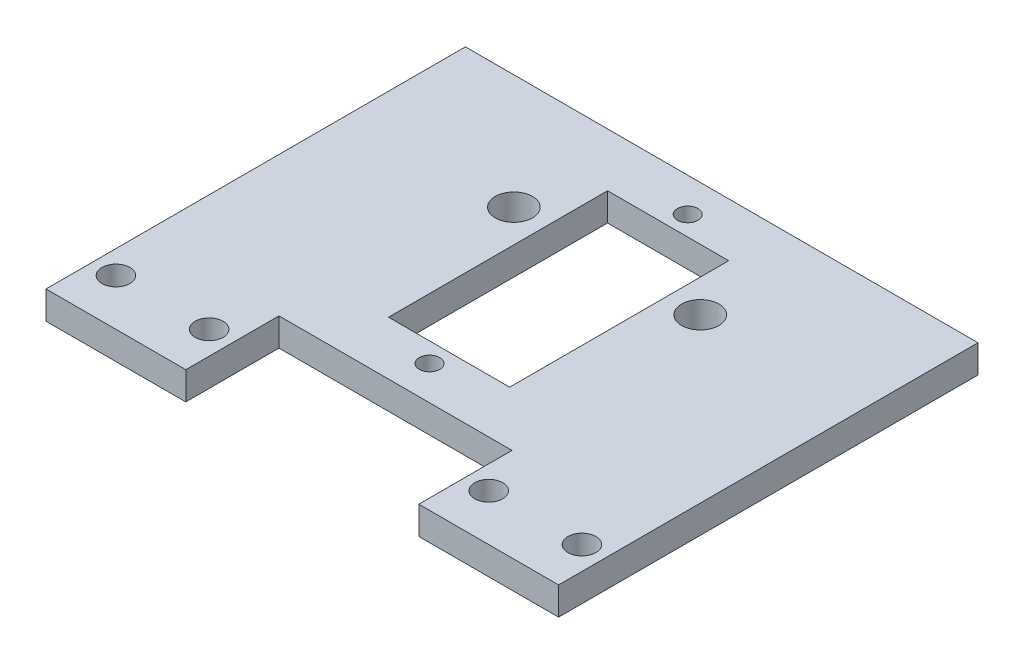
ISO-10303-21;
HEADER;
FILE_DESCRIPTION(('STEP AP214'),'2;1');
FILE_NAME('part.step','',(''),(''),'','','');
FILE_SCHEMA(('AUTOMOTIVE_DESIGN { 1 0 10303 214 1 1 1 1 }'));
ENDSEC;
DATA;
#1=APPLICATION_CONTEXT('core data for automotive mechanical design processes');
#2=APPLICATION_PROTOCOL_DEFINITION('international standard','automotive_design',2000,#1);
#3=PRODUCT_CONTEXT('',#1,'mechanical');
#4=PRODUCT('Part','Part','',(#3));
#5=PRODUCT_RELATED_PRODUCT_CATEGORY('part','',(#4));
#6=PRODUCT_DEFINITION_FORMATION('','',#4);
#7=PRODUCT_DEFINITION_CONTEXT('part definition',#1,'design');
#8=PRODUCT_DEFINITION('design','',#6,#7);
#9=PRODUCT_DEFINITION_SHAPE('','',#8);
#10=(LENGTH_UNIT() NAMED_UNIT(*) SI_UNIT(.MILLI.,.METRE.));
#11=(NAMED_UNIT(*) PLANE_ANGLE_UNIT() SI_UNIT($,.RADIAN.));
#12=(NAMED_UNIT(*) SI_UNIT($,.STERADIAN.) SOLID_ANGLE_UNIT());
#13=UNCERTAINTY_MEASURE_WITH_UNIT(LENGTH_MEASURE(1.E-05),#10,'distance_accuracy_value','');
#14=(GEOMETRIC_REPRESENTATION_CONTEXT(3) GLOBAL_UNCERTAINTY_ASSIGNED_CONTEXT((#13)) GLOBAL_UNIT_ASSIGNED_CONTEXT((#10,
#11,#12)) REPRESENTATION_CONTEXT('',''));
#15=CARTESIAN_POINT('',(0.,0.,0.));
#16=DIRECTION('',(0.,0.,1.));
#17=DIRECTION('',(1.,0.,0.));
#18=AXIS2_PLACEMENT_3D('',#15,#16,#17);
#19=CARTESIAN_POINT('',(0.,3.,0.));
#20=DIRECTION('',(0.,1.,0.));
#21=DIRECTION('',(0.,0.,1.));
#22=AXIS2_PLACEMENT_3D('',#19,#20,#21);
#23=PLANE('',#22);
#24=CARTESIAN_POINT('',(37.4999999999785,3.,-32.6999697831586));
#25=DIRECTION('',(0.,1.,0.));
#26=DIRECTION('',(0.,0.,-1.));
#27=AXIS2_PLACEMENT_3D('',#24,#25,#26);
#28=CIRCLE('',#27,2.);
#29=CARTESIAN_POINT('',(37.4999999999785,3.,-34.6999697831586));
#30=VERTEX_POINT('',#29);
#31=EDGE_CURVE('E341',#30,#30,#28,.T.);
#32=ORIENTED_EDGE('',*,*,#31,.F.);
#33=EDGE_LOOP('',(#32));
#34=FACE_BOUND('',#33,.T.);
#35=CARTESIAN_POINT('',(17.5000000000215,3.,-32.6999697831586));
#36=DIRECTION('',(0.,1.,0.));
#37=DIRECTION('',(0.,0.,1.));
#38=AXIS2_PLACEMENT_3D('',#35,#36,#37);
#39=CIRCLE('',#38,2.);
#40=CARTESIAN_POINT('',(17.5000000000215,3.,-30.6999697831586));
#41=VERTEX_POINT('',#40);
#42=EDGE_CURVE('E347',#41,#41,#39,.T.);
#43=ORIENTED_EDGE('',*,*,#42,.F.);
#44=EDGE_LOOP('',(#43));
#45=FACE_BOUND('',#44,.T.);
#46=CARTESIAN_POINT('',(2.5,3.,-4.99999999999983));
#47=DIRECTION('',(0.,1.,0.));
#48=DIRECTION('',(0.,0.,1.));
#49=AXIS2_PLACEMENT_3D('',#46,#47,#48);
#50=CIRCLE('',#49,1.5);
#51=CARTESIAN_POINT('',(2.5,3.,-3.49999999999983));
#52=VERTEX_POINT('',#51);
#53=EDGE_CURVE('E358',#52,#52,#50,.T.);
#54=ORIENTED_EDGE('',*,*,#53,.F.);
#55=EDGE_LOOP('',(#54));
#56=FACE_BOUND('',#55,.T.);
#57=CARTESIAN_POINT('',(52.5,3.,-5.));
#58=DIRECTION('',(0.,1.,0.));
#59=DIRECTION('',(0.,0.,1.));
#60=AXIS2_PLACEMENT_3D('',#57,#58,#59);
#61=CIRCLE('',#60,1.5);
#62=CARTESIAN_POINT('',(52.5,3.,-3.5));
#63=VERTEX_POINT('',#62);
#64=EDGE_CURVE('E370',#63,#63,#61,.T.);
#65=ORIENTED_EDGE('',*,*,#64,.F.);
#66=EDGE_LOOP('',(#65));
#67=FACE_BOUND('',#66,.T.);
#68=CARTESIAN_POINT('',(27.5,3.,-13.65));
#69=DIRECTION('',(0.,1.,0.));
#70=DIRECTION('',(0.,0.,-1.));
#71=AXIS2_PLACEMENT_3D('',#68,#69,#70);
#72=CIRCLE('',#71,1.09999999999999);
#73=CARTESIAN_POINT('',(27.5,3.,-14.75));
#74=VERTEX_POINT('',#73);
#75=EDGE_CURVE('E163',#74,#74,#72,.T.);
#76=ORIENTED_EDGE('',*,*,#75,.F.);
#77=EDGE_LOOP('',(#76));
#78=FACE_BOUND('',#77,.T.);
#79=DIRECTION('',(0.,0.,1.));
#80=VECTOR('',#79,1.);
#81=CARTESIAN_POINT('',(0.,3.,-45.));
#82=LINE('',#81,#80);
#83=CARTESIAN_POINT('',(0.,3.,-45.));
#84=VERTEX_POINT('',#83);
#85=CARTESIAN_POINT('',(0.,3.,0.));
#86=VERTEX_POINT('',#85);
#87=EDGE_CURVE('E173',#84,#86,#82,.T.);
#88=ORIENTED_EDGE('',*,*,#87,.T.);
#89=DIRECTION('',(1.,0.,0.));
#90=VECTOR('',#89,1.);
#91=CARTESIAN_POINT('',(0.,3.,0.));
#92=LINE('',#91,#90);
#93=CARTESIAN_POINT('',(15.,3.,0.));
#94=VERTEX_POINT('',#93);
#95=EDGE_CURVE('E176',#86,#94,#92,.T.);
#96=ORIENTED_EDGE('',*,*,#95,.T.);
#97=DIRECTION('',(0.,0.,-1.));
#98=VECTOR('',#97,1.);
#99=CARTESIAN_POINT('',(15.,3.,0.));
#100=LINE('',#99,#98);
#101=CARTESIAN_POINT('',(15.,3.,-10.));
#102=VERTEX_POINT('',#101);
#103=EDGE_CURVE('E179',#94,#102,#100,.T.);
#104=ORIENTED_EDGE('',*,*,#103,.T.);
#105=DIRECTION('',(1.,0.,0.));
#106=VECTOR('',#105,1.);
#107=CARTESIAN_POINT('',(15.,3.,-10.));
#108=LINE('',#107,#106);
#109=CARTESIAN_POINT('',(40.,3.,-10.));
#110=VERTEX_POINT('',#109);
#111=EDGE_CURVE('E181',#102,#110,#108,.T.);
#112=ORIENTED_EDGE('',*,*,#111,.T.);
#113=DIRECTION('',(0.,0.,1.));
#114=VECTOR('',#113,1.);
#115=CARTESIAN_POINT('',(40.,3.,-10.));
#116=LINE('',#115,#114);
#117=CARTESIAN_POINT('',(40.,3.,0.));
#118=VERTEX_POINT('',#117);
#119=EDGE_CURVE('E183',#110,#118,#116,.T.);
#120=ORIENTED_EDGE('',*,*,#119,.T.);
#121=DIRECTION('',(1.,0.,0.));
#122=VECTOR('',#121,1.);
#123=CARTESIAN_POINT('',(40.,3.,0.));
#124=LINE('',#123,#122);
#125=CARTESIAN_POINT('',(55.,3.,0.));
#126=VERTEX_POINT('',#125);
#127=EDGE_CURVE('E185',#118,#126,#124,.T.);
#128=ORIENTED_EDGE('',*,*,#127,.T.);
#129=DIRECTION('',(0.,0.,-1.));
#130=VECTOR('',#129,1.);
#131=CARTESIAN_POINT('',(55.,3.,0.));
#132=LINE('',#131,#130);
#133=CARTESIAN_POINT('',(55.,3.,-45.));
#134=VERTEX_POINT('',#133);
#135=EDGE_CURVE('E187',#126,#134,#132,.T.);
#136=ORIENTED_EDGE('',*,*,#135,.T.);
#137=DIRECTION('',(-1.,0.,0.));
#138=VECTOR('',#137,1.);
#139=CARTESIAN_POINT('',(55.,3.,-45.));
#140=LINE('',#139,#138);
#141=EDGE_CURVE('E189',#134,#84,#140,.T.);
#142=ORIENTED_EDGE('',*,*,#141,.T.);
#143=EDGE_LOOP('',(#88,#96,#104,#112,#120,#128,#136,#142));
#144=FACE_BOUND('',#143,.T.);
#145=DIRECTION('',(1.,0.,0.));
#146=VECTOR('',#145,1.);
#147=CARTESIAN_POINT('',(21.0000000000001,3.,-15.7499999999999));
#148=LINE('',#147,#146);
#149=CARTESIAN_POINT('',(21.0000000000001,3.,-15.7499999999999));
#150=VERTEX_POINT('',#149);
#151=CARTESIAN_POINT('',(34.0000000000001,3.,-15.75));
#152=VERTEX_POINT('',#151);
#153=EDGE_CURVE('E142',#150,#152,#148,.T.);
#154=ORIENTED_EDGE('',*,*,#153,.F.);
#155=DIRECTION('',(0.,0.,1.));
#156=VECTOR('',#155,1.);
#157=CARTESIAN_POINT('',(20.9999999999999,3.,-39.2499999999999));
#158=LINE('',#157,#156);
#159=CARTESIAN_POINT('',(20.9999999999999,3.,-39.2499999999999));
#160=VERTEX_POINT('',#159);
#161=EDGE_CURVE('E134',#160,#150,#158,.T.);
#162=ORIENTED_EDGE('',*,*,#161,.F.);
#163=DIRECTION('',(-1.,0.,0.));
#164=VECTOR('',#163,1.);
#165=CARTESIAN_POINT('',(20.9999999999999,3.,-39.2499999999999));
#166=LINE('',#165,#164);
#167=CARTESIAN_POINT('',(33.9999999999999,3.,-39.25));
#168=VERTEX_POINT('',#167);
#169=EDGE_CURVE('E157',#168,#160,#166,.T.);
#170=ORIENTED_EDGE('',*,*,#169,.F.);
#171=DIRECTION('',(0.,0.,-1.));
#172=VECTOR('',#171,1.);
#173=CARTESIAN_POINT('',(33.9999999999999,3.,-39.25));
#174=LINE('',#173,#172);
#175=EDGE_CURVE('E155',#152,#168,#174,.T.);
#176=ORIENTED_EDGE('',*,*,#175,.F.);
#177=EDGE_LOOP('',(#154,#162,#170,#176));
#178=FACE_BOUND('',#177,.T.);
#179=CARTESIAN_POINT('',(42.5,3.,-5.));
#180=DIRECTION('',(0.,1.,0.));
#181=DIRECTION('',(0.,0.,1.));
#182=AXIS2_PLACEMENT_3D('',#179,#180,#181);
#183=CIRCLE('',#182,1.5);
#184=CARTESIAN_POINT('',(42.5,3.,-3.5));
#185=VERTEX_POINT('',#184);
#186=EDGE_CURVE('E376',#185,#185,#183,.T.);
#187=ORIENTED_EDGE('',*,*,#186,.F.);
#188=EDGE_LOOP('',(#187));
#189=FACE_BOUND('',#188,.T.);
#190=CARTESIAN_POINT('',(12.5,3.,-4.9999999999999));
#191=DIRECTION('',(0.,1.,0.));
#192=DIRECTION('',(0.,0.,1.));
#193=AXIS2_PLACEMENT_3D('',#190,#191,#192);
#194=CIRCLE('',#193,1.5);
#195=CARTESIAN_POINT('',(12.5,3.,-3.49999999999989));
#196=VERTEX_POINT('',#195);
#197=EDGE_CURVE('E364',#196,#196,#194,.T.);
#198=ORIENTED_EDGE('',*,*,#197,.F.);
#199=EDGE_LOOP('',(#198));
#200=FACE_BOUND('',#199,.T.);
#201=CARTESIAN_POINT('',(27.5,3.,-41.35));
#202=DIRECTION('',(0.,1.,0.));
#203=DIRECTION('',(0.,0.,1.));
#204=AXIS2_PLACEMENT_3D('',#201,#202,#203);
#205=CIRCLE('',#204,1.09999999999999);
#206=CARTESIAN_POINT('',(27.5,3.,-40.25));
#207=VERTEX_POINT('',#206);
#208=EDGE_CURVE('E352',#207,#207,#205,.T.);
#209=ORIENTED_EDGE('',*,*,#208,.F.);
#210=EDGE_LOOP('',(#209));
#211=FACE_BOUND('',#210,.T.);
#212=ADVANCED_FACE('F45',(#34,#45,#56,#67,#78,#144,#178,#189,#200,#211),#23,.T.);
#213=CARTESIAN_POINT('',(0.,0.,0.));
#214=DIRECTION('',(0.,1.,0.));
#215=DIRECTION('',(0.,0.,1.));
#216=AXIS2_PLACEMENT_3D('',#213,#214,#215);
#217=PLANE('',#216);
#218=CARTESIAN_POINT('',(37.4999999999785,0.,-32.6999697831586));
#219=DIRECTION('',(0.,1.,0.));
#220=DIRECTION('',(0.,0.,-1.));
#221=AXIS2_PLACEMENT_3D('',#218,#219,#220);
#222=CIRCLE('',#221,2.);
#223=CARTESIAN_POINT('',(37.4999999999785,0.,-34.6999697831586));
#224=VERTEX_POINT('',#223);
#225=EDGE_CURVE('E339',#224,#224,#222,.T.);
#226=ORIENTED_EDGE('',*,*,#225,.T.);
#227=EDGE_LOOP('',(#226));
#228=FACE_BOUND('',#227,.T.);
#229=CARTESIAN_POINT('',(17.5000000000215,0.,-32.6999697831586));
#230=DIRECTION('',(0.,1.,0.));
#231=DIRECTION('',(0.,0.,1.));
#232=AXIS2_PLACEMENT_3D('',#229,#230,#231);
#233=CIRCLE('',#232,2.);
#234=CARTESIAN_POINT('',(17.5000000000215,0.,-30.6999697831586));
#235=VERTEX_POINT('',#234);
#236=EDGE_CURVE('E342',#235,#235,#233,.T.);
#237=ORIENTED_EDGE('',*,*,#236,.T.);
#238=EDGE_LOOP('',(#237));
#239=FACE_BOUND('',#238,.T.);
#240=DIRECTION('',(0.,0.,1.));
#241=VECTOR('',#240,1.);
#242=CARTESIAN_POINT('',(0.,0.,-45.));
#243=LINE('',#242,#241);
#244=CARTESIAN_POINT('',(0.,0.,-45.));
#245=VERTEX_POINT('',#244);
#246=CARTESIAN_POINT('',(0.,0.,0.));
#247=VERTEX_POINT('',#246);
#248=EDGE_CURVE('E150',#245,#247,#243,.T.);
#249=ORIENTED_EDGE('',*,*,#248,.F.);
#250=DIRECTION('',(-1.,0.,0.));
#251=VECTOR('',#250,1.);
#252=CARTESIAN_POINT('',(55.,0.,-45.));
#253=LINE('',#252,#251);
#254=CARTESIAN_POINT('',(55.,0.,-45.));
#255=VERTEX_POINT('',#254);
#256=EDGE_CURVE('E177',#255,#245,#253,.T.);
#257=ORIENTED_EDGE('',*,*,#256,.F.);
#258=DIRECTION('',(0.,0.,-1.));
#259=VECTOR('',#258,1.);
#260=CARTESIAN_POINT('',(55.,0.,0.));
#261=LINE('',#260,#259);
#262=CARTESIAN_POINT('',(55.,0.,0.));
#263=VERTEX_POINT('',#262);
#264=EDGE_CURVE('E204',#263,#255,#261,.T.);
#265=ORIENTED_EDGE('',*,*,#264,.F.);
#266=DIRECTION('',(1.,0.,0.));
#267=VECTOR('',#266,1.);
#268=CARTESIAN_POINT('',(40.,0.,0.));
#269=LINE('',#268,#267);
#270=CARTESIAN_POINT('',(40.,0.,0.));
#271=VERTEX_POINT('',#270);
#272=EDGE_CURVE('E202',#271,#263,#269,.T.);
#273=ORIENTED_EDGE('',*,*,#272,.F.);
#274=DIRECTION('',(0.,0.,1.));
#275=VECTOR('',#274,1.);
#276=CARTESIAN_POINT('',(40.,0.,-10.));
#277=LINE('',#276,#275);
#278=CARTESIAN_POINT('',(40.,0.,-10.));
#279=VERTEX_POINT('',#278);
#280=EDGE_CURVE('E200',#279,#271,#277,.T.);
#281=ORIENTED_EDGE('',*,*,#280,.F.);
#282=DIRECTION('',(1.,0.,0.));
#283=VECTOR('',#282,1.);
#284=CARTESIAN_POINT('',(15.,0.,-10.));
#285=LINE('',#284,#283);
#286=CARTESIAN_POINT('',(15.,0.,-10.));
#287=VERTEX_POINT('',#286);
#288=EDGE_CURVE('E198',#287,#279,#285,.T.);
#289=ORIENTED_EDGE('',*,*,#288,.F.);
#290=DIRECTION('',(0.,0.,-1.));
#291=VECTOR('',#290,1.);
#292=CARTESIAN_POINT('',(15.,0.,0.));
#293=LINE('',#292,#291);
#294=CARTESIAN_POINT('',(15.,0.,0.));
#295=VERTEX_POINT('',#294);
#296=EDGE_CURVE('E196',#295,#287,#293,.T.);
#297=ORIENTED_EDGE('',*,*,#296,.F.);
#298=DIRECTION('',(1.,0.,0.));
#299=VECTOR('',#298,1.);
#300=CARTESIAN_POINT('',(0.,0.,0.));
#301=LINE('',#300,#299);
#302=EDGE_CURVE('E194',#247,#295,#301,.T.);
#303=ORIENTED_EDGE('',*,*,#302,.F.);
#304=EDGE_LOOP('',(#249,#257,#265,#273,#281,#289,#297,#303));
#305=FACE_BOUND('',#304,.T.);
#306=DIRECTION('',(0.,0.,1.));
#307=VECTOR('',#306,1.);
#308=CARTESIAN_POINT('',(20.9999999999999,0.,-39.2499999999999));
#309=LINE('',#308,#307);
#310=CARTESIAN_POINT('',(20.9999999999999,0.,-39.2499999999999));
#311=VERTEX_POINT('',#310);
#312=CARTESIAN_POINT('',(21.0000000000001,0.,-15.7499999999999));
#313=VERTEX_POINT('',#312);
#314=EDGE_CURVE('E68',#311,#313,#309,.T.);
#315=ORIENTED_EDGE('',*,*,#314,.T.);
#316=DIRECTION('',(1.,0.,0.));
#317=VECTOR('',#316,1.);
#318=CARTESIAN_POINT('',(21.0000000000001,0.,-15.7499999999999));
#319=LINE('',#318,#317);
#320=CARTESIAN_POINT('',(34.0000000000001,0.,-15.75));
#321=VERTEX_POINT('',#320);
#322=EDGE_CURVE('E149',#313,#321,#319,.T.);
#323=ORIENTED_EDGE('',*,*,#322,.T.);
#324=DIRECTION('',(0.,0.,-1.));
#325=VECTOR('',#324,1.);
#326=CARTESIAN_POINT('',(33.9999999999999,0.,-39.25));
#327=LINE('',#326,#325);
#328=CARTESIAN_POINT('',(33.9999999999999,0.,-39.25));
#329=VERTEX_POINT('',#328);
#330=EDGE_CURVE('E165',#321,#329,#327,.T.);
#331=ORIENTED_EDGE('',*,*,#330,.T.);
#332=DIRECTION('',(-1.,0.,0.));
#333=VECTOR('',#332,1.);
#334=CARTESIAN_POINT('',(20.9999999999999,0.,-39.2499999999999));
#335=LINE('',#334,#333);
#336=EDGE_CURVE('E143',#329,#311,#335,.T.);
#337=ORIENTED_EDGE('',*,*,#336,.T.);
#338=EDGE_LOOP('',(#315,#323,#331,#337));
#339=FACE_BOUND('',#338,.T.);
#340=CARTESIAN_POINT('',(27.5,0.,-13.65));
#341=DIRECTION('',(0.,1.,0.));
#342=DIRECTION('',(0.,0.,-1.));
#343=AXIS2_PLACEMENT_3D('',#340,#341,#342);
#344=CIRCLE('',#343,1.09999999999999);
#345=CARTESIAN_POINT('',(27.5,0.,-14.75));
#346=VERTEX_POINT('',#345);
#347=EDGE_CURVE('E379',#346,#346,#344,.T.);
#348=ORIENTED_EDGE('',*,*,#347,.T.);
#349=EDGE_LOOP('',(#348));
#350=FACE_BOUND('',#349,.T.);
#351=CARTESIAN_POINT('',(42.5,0.,-5.));
#352=DIRECTION('',(0.,1.,0.));
#353=DIRECTION('',(0.,0.,1.));
#354=AXIS2_PLACEMENT_3D('',#351,#352,#353);
#355=CIRCLE('',#354,1.5);
#356=CARTESIAN_POINT('',(42.5,0.,-3.5));
#357=VERTEX_POINT('',#356);
#358=EDGE_CURVE('E373',#357,#357,#355,.T.);
#359=ORIENTED_EDGE('',*,*,#358,.T.);
#360=EDGE_LOOP('',(#359));
#361=FACE_BOUND('',#360,.T.);
#362=CARTESIAN_POINT('',(52.5,0.,-5.));
#363=DIRECTION('',(0.,1.,0.));
#364=DIRECTION('',(0.,0.,1.));
#365=AXIS2_PLACEMENT_3D('',#362,#363,#364);
#366=CIRCLE('',#365,1.5);
#367=CARTESIAN_POINT('',(52.5,0.,-3.5));
#368=VERTEX_POINT('',#367);
#369=EDGE_CURVE('E367',#368,#368,#366,.T.);
#370=ORIENTED_EDGE('',*,*,#369,.T.);
#371=EDGE_LOOP('',(#370));
#372=FACE_BOUND('',#371,.T.);
#373=CARTESIAN_POINT('',(12.5,0.,-4.9999999999999));
#374=DIRECTION('',(0.,1.,0.));
#375=DIRECTION('',(0.,0.,1.));
#376=AXIS2_PLACEMENT_3D('',#373,#374,#375);
#377=CIRCLE('',#376,1.5);
#378=CARTESIAN_POINT('',(12.5,0.,-3.49999999999989));
#379=VERTEX_POINT('',#378);
#380=EDGE_CURVE('E361',#379,#379,#377,.T.);
#381=ORIENTED_EDGE('',*,*,#380,.T.);
#382=EDGE_LOOP('',(#381));
#383=FACE_BOUND('',#382,.T.);
#384=CARTESIAN_POINT('',(2.5,0.,-4.99999999999983));
#385=DIRECTION('',(0.,1.,0.));
#386=DIRECTION('',(0.,0.,1.));
#387=AXIS2_PLACEMENT_3D('',#384,#385,#386);
#388=CIRCLE('',#387,1.5);
#389=CARTESIAN_POINT('',(2.5,0.,-3.49999999999983));
#390=VERTEX_POINT('',#389);
#391=EDGE_CURVE('E355',#390,#390,#388,.T.);
#392=ORIENTED_EDGE('',*,*,#391,.T.);
#393=EDGE_LOOP('',(#392));
#394=FACE_BOUND('',#393,.T.);
#395=CARTESIAN_POINT('',(27.5,0.,-41.35));
#396=DIRECTION('',(0.,1.,0.));
#397=DIRECTION('',(0.,0.,1.));
#398=AXIS2_PLACEMENT_3D('',#395,#396,#397);
#399=CIRCLE('',#398,1.09999999999999);
#400=CARTESIAN_POINT('',(27.5,0.,-40.25));
#401=VERTEX_POINT('',#400);
#402=EDGE_CURVE('E344',#401,#401,#399,.T.);
#403=ORIENTED_EDGE('',*,*,#402,.T.);
#404=EDGE_LOOP('',(#403));
#405=FACE_BOUND('',#404,.T.);
#406=ADVANCED_FACE('F234',(#228,#239,#305,#339,#350,#361,#372,#383,#394,#405),#217,.F.);
#407=CARTESIAN_POINT('',(0.,3.,-45.));
#408=DIRECTION('',(1.,0.,0.));
#409=DIRECTION('',(0.,0.,-1.));
#410=AXIS2_PLACEMENT_3D('',#407,#408,#409);
#411=PLANE('',#410);
#412=ORIENTED_EDGE('',*,*,#248,.T.);
#413=DIRECTION('',(0.,-1.,0.));
#414=VECTOR('',#413,1.);
#415=CARTESIAN_POINT('',(0.,3.,0.));
#416=LINE('',#415,#414);
#417=EDGE_CURVE('E11',#86,#247,#416,.T.);
#418=ORIENTED_EDGE('',*,*,#417,.F.);
#419=ORIENTED_EDGE('',*,*,#87,.F.);
#420=DIRECTION('',(0.,-1.,0.));
#421=VECTOR('',#420,1.);
#422=CARTESIAN_POINT('',(0.,3.,-45.));
#423=LINE('',#422,#421);
#424=EDGE_CURVE('E191',#84,#245,#423,.T.);
#425=ORIENTED_EDGE('',*,*,#424,.T.);
#426=EDGE_LOOP('',(#412,#418,#419,#425));
#427=FACE_BOUND('',#426,.T.);
#428=ADVANCED_FACE('F47',(#427),#411,.F.);
#429=CARTESIAN_POINT('',(0.,3.,0.));
#430=DIRECTION('',(0.,0.,-1.));
#431=DIRECTION('',(-1.,0.,0.));
#432=AXIS2_PLACEMENT_3D('',#429,#430,#431);
#433=PLANE('',#432);
#434=ORIENTED_EDGE('',*,*,#302,.T.);
#435=DIRECTION('',(0.,-1.,0.));
#436=VECTOR('',#435,1.);
#437=CARTESIAN_POINT('',(15.,3.,0.));
#438=LINE('',#437,#436);
#439=EDGE_CURVE('E53',#94,#295,#438,.T.);
#440=ORIENTED_EDGE('',*,*,#439,.F.);
#441=ORIENTED_EDGE('',*,*,#95,.F.);
#442=ORIENTED_EDGE('',*,*,#417,.T.);
#443=EDGE_LOOP('',(#434,#440,#441,#442));
#444=FACE_BOUND('',#443,.T.);
#445=ADVANCED_FACE('F251',(#444),#433,.F.);
#446=CARTESIAN_POINT('',(15.,3.,0.));
#447=DIRECTION('',(-1.,0.,0.));
#448=DIRECTION('',(0.,0.,1.));
#449=AXIS2_PLACEMENT_3D('',#446,#447,#448);
#450=PLANE('',#449);
#451=ORIENTED_EDGE('',*,*,#296,.T.);
#452=DIRECTION('',(0.,-1.,0.));
#453=VECTOR('',#452,1.);
#454=CARTESIAN_POINT('',(15.,3.,-10.));
#455=LINE('',#454,#453);
#456=EDGE_CURVE('E221',#102,#287,#455,.T.);
#457=ORIENTED_EDGE('',*,*,#456,.F.);
#458=ORIENTED_EDGE('',*,*,#103,.F.);
#459=ORIENTED_EDGE('',*,*,#439,.T.);
#460=EDGE_LOOP('',(#451,#457,#458,#459));
#461=FACE_BOUND('',#460,.T.);
#462=ADVANCED_FACE('F228',(#461),#450,.F.);
#463=CARTESIAN_POINT('',(15.,3.,-10.));
#464=DIRECTION('',(0.,0.,-1.));
#465=DIRECTION('',(-1.,0.,0.));
#466=AXIS2_PLACEMENT_3D('',#463,#464,#465);
#467=PLANE('',#466);
#468=ORIENTED_EDGE('',*,*,#288,.T.);
#469=DIRECTION('',(0.,-1.,0.));
#470=VECTOR('',#469,1.);
#471=CARTESIAN_POINT('',(40.,3.,-10.));
#472=LINE('',#471,#470);
#473=EDGE_CURVE('E218',#110,#279,#472,.T.);
#474=ORIENTED_EDGE('',*,*,#473,.F.);
#475=ORIENTED_EDGE('',*,*,#111,.F.);
#476=ORIENTED_EDGE('',*,*,#456,.T.);
#477=EDGE_LOOP('',(#468,#474,#475,#476));
#478=FACE_BOUND('',#477,.T.);
#479=ADVANCED_FACE('F240',(#478),#467,.F.);
#480=CARTESIAN_POINT('',(40.,3.,-10.));
#481=DIRECTION('',(1.,0.,0.));
#482=DIRECTION('',(0.,0.,-1.));
#483=AXIS2_PLACEMENT_3D('',#480,#481,#482);
#484=PLANE('',#483);
#485=ORIENTED_EDGE('',*,*,#280,.T.);
#486=DIRECTION('',(0.,-1.,0.));
#487=VECTOR('',#486,1.);
#488=CARTESIAN_POINT('',(40.,3.,0.));
#489=LINE('',#488,#487);
#490=EDGE_CURVE('E215',#118,#271,#489,.T.);
#491=ORIENTED_EDGE('',*,*,#490,.F.);
#492=ORIENTED_EDGE('',*,*,#119,.F.);
#493=ORIENTED_EDGE('',*,*,#473,.T.);
#494=EDGE_LOOP('',(#485,#491,#492,#493));
#495=FACE_BOUND('',#494,.T.);
#496=ADVANCED_FACE('F244',(#495),#484,.F.);
#497=CARTESIAN_POINT('',(40.,3.,0.));
#498=DIRECTION('',(0.,0.,-1.));
#499=DIRECTION('',(-1.,0.,0.));
#500=AXIS2_PLACEMENT_3D('',#497,#498,#499);
#501=PLANE('',#500);
#502=ORIENTED_EDGE('',*,*,#272,.T.);
#503=DIRECTION('',(0.,-1.,0.));
#504=VECTOR('',#503,1.);
#505=CARTESIAN_POINT('',(55.,3.,0.));
#506=LINE('',#505,#504);
#507=EDGE_CURVE('E212',#126,#263,#506,.T.);
#508=ORIENTED_EDGE('',*,*,#507,.F.);
#509=ORIENTED_EDGE('',*,*,#127,.F.);
#510=ORIENTED_EDGE('',*,*,#490,.T.);
#511=EDGE_LOOP('',(#502,#508,#509,#510));
#512=FACE_BOUND('',#511,.T.);
#513=ADVANCED_FACE('F264',(#512),#501,.F.);
#514=CARTESIAN_POINT('',(55.,3.,0.));
#515=DIRECTION('',(-1.,0.,0.));
#516=DIRECTION('',(0.,0.,1.));
#517=AXIS2_PLACEMENT_3D('',#514,#515,#516);
#518=PLANE('',#517);
#519=ORIENTED_EDGE('',*,*,#264,.T.);
#520=DIRECTION('',(0.,-1.,0.));
#521=VECTOR('',#520,1.);
#522=CARTESIAN_POINT('',(55.,3.,-45.));
#523=LINE('',#522,#521);
#524=EDGE_CURVE('E209',#134,#255,#523,.T.);
#525=ORIENTED_EDGE('',*,*,#524,.F.);
#526=ORIENTED_EDGE('',*,*,#135,.F.);
#527=ORIENTED_EDGE('',*,*,#507,.T.);
#528=EDGE_LOOP('',(#519,#525,#526,#527));
#529=FACE_BOUND('',#528,.T.);
#530=ADVANCED_FACE('F262',(#529),#518,.F.);
#531=CARTESIAN_POINT('',(55.,3.,-45.));
#532=DIRECTION('',(0.,0.,1.));
#533=DIRECTION('',(1.,0.,0.));
#534=AXIS2_PLACEMENT_3D('',#531,#532,#533);
#535=PLANE('',#534);
#536=ORIENTED_EDGE('',*,*,#256,.T.);
#537=ORIENTED_EDGE('',*,*,#424,.F.);
#538=ORIENTED_EDGE('',*,*,#141,.F.);
#539=ORIENTED_EDGE('',*,*,#524,.T.);
#540=EDGE_LOOP('',(#536,#537,#538,#539));
#541=FACE_BOUND('',#540,.T.);
#542=ADVANCED_FACE('F257',(#541),#535,.F.);
#543=CARTESIAN_POINT('',(20.9999999999999,3.,-39.2499999999999));
#544=DIRECTION('',(1.,0.,0.));
#545=DIRECTION('',(0.,0.,-1.));
#546=AXIS2_PLACEMENT_3D('',#543,#544,#545);
#547=PLANE('',#546);
#548=ORIENTED_EDGE('',*,*,#314,.F.);
#549=DIRECTION('',(0.,-1.,0.));
#550=VECTOR('',#549,1.);
#551=CARTESIAN_POINT('',(20.9999999999999,3.,-39.2499999999999));
#552=LINE('',#551,#550);
#553=EDGE_CURVE('E138',#160,#311,#552,.T.);
#554=ORIENTED_EDGE('',*,*,#553,.F.);
#555=ORIENTED_EDGE('',*,*,#161,.T.);
#556=DIRECTION('',(0.,-1.,0.));
#557=VECTOR('',#556,1.);
#558=CARTESIAN_POINT('',(21.0000000000001,3.,-15.7499999999999));
#559=LINE('',#558,#557);
#560=EDGE_CURVE('E137',#150,#313,#559,.T.);
#561=ORIENTED_EDGE('',*,*,#560,.T.);
#562=EDGE_LOOP('',(#548,#554,#555,#561));
#563=FACE_BOUND('',#562,.T.);
#564=ADVANCED_FACE('F136',(#563),#547,.T.);
#565=CARTESIAN_POINT('',(21.0000000000001,3.,-15.7499999999999));
#566=DIRECTION('',(0.,0.,-1.));
#567=DIRECTION('',(-1.,0.,0.));
#568=AXIS2_PLACEMENT_3D('',#565,#566,#567);
#569=PLANE('',#568);
#570=ORIENTED_EDGE('',*,*,#322,.F.);
#571=ORIENTED_EDGE('',*,*,#560,.F.);
#572=ORIENTED_EDGE('',*,*,#153,.T.);
#573=DIRECTION('',(0.,-1.,0.));
#574=VECTOR('',#573,1.);
#575=CARTESIAN_POINT('',(34.0000000000001,3.,-15.75));
#576=LINE('',#575,#574);
#577=EDGE_CURVE('E151',#152,#321,#576,.T.);
#578=ORIENTED_EDGE('',*,*,#577,.T.);
#579=EDGE_LOOP('',(#570,#571,#572,#578));
#580=FACE_BOUND('',#579,.T.);
#581=ADVANCED_FACE('F146',(#580),#569,.T.);
#582=CARTESIAN_POINT('',(33.9999999999999,3.,-39.25));
#583=DIRECTION('',(-1.,0.,0.));
#584=DIRECTION('',(0.,0.,1.));
#585=AXIS2_PLACEMENT_3D('',#582,#583,#584);
#586=PLANE('',#585);
#587=ORIENTED_EDGE('',*,*,#330,.F.);
#588=ORIENTED_EDGE('',*,*,#577,.F.);
#589=ORIENTED_EDGE('',*,*,#175,.T.);
#590=DIRECTION('',(0.,-1.,0.));
#591=VECTOR('',#590,1.);
#592=CARTESIAN_POINT('',(33.9999999999999,3.,-39.25));
#593=LINE('',#592,#591);
#594=EDGE_CURVE('E60',#168,#329,#593,.T.);
#595=ORIENTED_EDGE('',*,*,#594,.T.);
#596=EDGE_LOOP('',(#587,#588,#589,#595));
#597=FACE_BOUND('',#596,.T.);
#598=ADVANCED_FACE('F294',(#597),#586,.T.);
#599=CARTESIAN_POINT('',(20.9999999999999,3.,-39.2499999999999));
#600=DIRECTION('',(0.,0.,1.));
#601=DIRECTION('',(1.,0.,0.));
#602=AXIS2_PLACEMENT_3D('',#599,#600,#601);
#603=PLANE('',#602);
#604=ORIENTED_EDGE('',*,*,#336,.F.);
#605=ORIENTED_EDGE('',*,*,#594,.F.);
#606=ORIENTED_EDGE('',*,*,#169,.T.);
#607=ORIENTED_EDGE('',*,*,#553,.T.);
#608=EDGE_LOOP('',(#604,#605,#606,#607));
#609=FACE_BOUND('',#608,.T.);
#610=ADVANCED_FACE('F298',(#609),#603,.T.);
#611=CARTESIAN_POINT('',(27.5,3.,-13.65));
#612=DIRECTION('',(0.,-1.,0.));
#613=DIRECTION('',(0.,0.,-1.));
#614=AXIS2_PLACEMENT_3D('',#611,#612,#613);
#615=CYLINDRICAL_SURFACE('',#614,1.09999999999999);
#616=ORIENTED_EDGE('',*,*,#75,.T.);
#617=EDGE_LOOP('',(#616));
#618=FACE_BOUND('',#617,.T.);
#619=ORIENTED_EDGE('',*,*,#347,.F.);
#620=EDGE_LOOP('',(#619));
#621=FACE_BOUND('',#620,.T.);
#622=ADVANCED_FACE('F304',(#618,#621),#615,.F.);
#623=CARTESIAN_POINT('',(42.5,3.,-5.));
#624=DIRECTION('',(0.,-1.,0.));
#625=DIRECTION('',(0.,0.,-1.));
#626=AXIS2_PLACEMENT_3D('',#623,#624,#625);
#627=CYLINDRICAL_SURFACE('',#626,1.5);
#628=ORIENTED_EDGE('',*,*,#186,.T.);
#629=EDGE_LOOP('',(#628));
#630=FACE_BOUND('',#629,.T.);
#631=ORIENTED_EDGE('',*,*,#358,.F.);
#632=EDGE_LOOP('',(#631));
#633=FACE_BOUND('',#632,.T.);
#634=ADVANCED_FACE('F307',(#630,#633),#627,.F.);
#635=CARTESIAN_POINT('',(52.5,3.,-5.));
#636=DIRECTION('',(0.,-1.,0.));
#637=DIRECTION('',(0.,0.,-1.));
#638=AXIS2_PLACEMENT_3D('',#635,#636,#637);
#639=CYLINDRICAL_SURFACE('',#638,1.5);
#640=ORIENTED_EDGE('',*,*,#64,.T.);
#641=EDGE_LOOP('',(#640));
#642=FACE_BOUND('',#641,.T.);
#643=ORIENTED_EDGE('',*,*,#369,.F.);
#644=EDGE_LOOP('',(#643));
#645=FACE_BOUND('',#644,.T.);
#646=ADVANCED_FACE('F311',(#642,#645),#639,.F.);
#647=CARTESIAN_POINT('',(12.5,3.,-4.9999999999999));
#648=DIRECTION('',(0.,-1.,0.));
#649=DIRECTION('',(0.,0.,-1.));
#650=AXIS2_PLACEMENT_3D('',#647,#648,#649);
#651=CYLINDRICAL_SURFACE('',#650,1.5);
#652=ORIENTED_EDGE('',*,*,#197,.T.);
#653=EDGE_LOOP('',(#652));
#654=FACE_BOUND('',#653,.T.);
#655=ORIENTED_EDGE('',*,*,#380,.F.);
#656=EDGE_LOOP('',(#655));
#657=FACE_BOUND('',#656,.T.);
#658=ADVANCED_FACE('F315',(#654,#657),#651,.F.);
#659=CARTESIAN_POINT('',(2.5,3.,-4.99999999999983));
#660=DIRECTION('',(0.,-1.,0.));
#661=DIRECTION('',(0.,0.,-1.));
#662=AXIS2_PLACEMENT_3D('',#659,#660,#661);
#663=CYLINDRICAL_SURFACE('',#662,1.5);
#664=ORIENTED_EDGE('',*,*,#53,.T.);
#665=EDGE_LOOP('',(#664));
#666=FACE_BOUND('',#665,.T.);
#667=ORIENTED_EDGE('',*,*,#391,.F.);
#668=EDGE_LOOP('',(#667));
#669=FACE_BOUND('',#668,.T.);
#670=ADVANCED_FACE('F319',(#666,#669),#663,.F.);
#671=CARTESIAN_POINT('',(27.5,3.,-41.35));
#672=DIRECTION('',(0.,-1.,0.));
#673=DIRECTION('',(0.,0.,-1.));
#674=AXIS2_PLACEMENT_3D('',#671,#672,#673);
#675=CYLINDRICAL_SURFACE('',#674,1.09999999999999);
#676=ORIENTED_EDGE('',*,*,#208,.T.);
#677=EDGE_LOOP('',(#676));
#678=FACE_BOUND('',#677,.T.);
#679=ORIENTED_EDGE('',*,*,#402,.F.);
#680=EDGE_LOOP('',(#679));
#681=FACE_BOUND('',#680,.T.);
#682=ADVANCED_FACE('F323',(#678,#681),#675,.F.);
#683=CARTESIAN_POINT('',(17.5000000000215,0.,-32.6999697831586));
#684=DIRECTION('',(0.,1.,0.));
#685=DIRECTION('',(0.,0.,1.));
#686=AXIS2_PLACEMENT_3D('',#683,#684,#685);
#687=CYLINDRICAL_SURFACE('',#686,2.);
#688=ORIENTED_EDGE('',*,*,#236,.F.);
#689=EDGE_LOOP('',(#688));
#690=FACE_BOUND('',#689,.T.);
#691=ORIENTED_EDGE('',*,*,#42,.T.);
#692=EDGE_LOOP('',(#691));
#693=FACE_BOUND('',#692,.T.);
#694=ADVANCED_FACE('F326',(#690,#693),#687,.F.);
#695=CARTESIAN_POINT('',(37.4999999999785,0.,-32.6999697831586));
#696=DIRECTION('',(0.,1.,0.));
#697=DIRECTION('',(0.,0.,1.));
#698=AXIS2_PLACEMENT_3D('',#695,#696,#697);
#699=CYLINDRICAL_SURFACE('',#698,2.);
#700=ORIENTED_EDGE('',*,*,#225,.F.);
#701=EDGE_LOOP('',(#700));
#702=FACE_BOUND('',#701,.T.);
#703=ORIENTED_EDGE('',*,*,#31,.T.);
#704=EDGE_LOOP('',(#703));
#705=FACE_BOUND('',#704,.T.);
#706=ADVANCED_FACE('F330',(#702,#705),#699,.F.);
#707=CLOSED_SHELL('',(#212,#406,#428,#445,#462,#479,#496,#513,#530,#542,#564,#581,#598,#610,
#622,#634,#646,#658,#670,#682,#694,#706));
#708=MANIFOLD_SOLID_BREP('B2',#707);
#709=ADVANCED_BREP_SHAPE_REPRESENTATION('',(#18,#708),#14);
#710=SHAPE_DEFINITION_REPRESENTATION(#9,#709);
ENDSEC;
END-ISO-10303-21;
